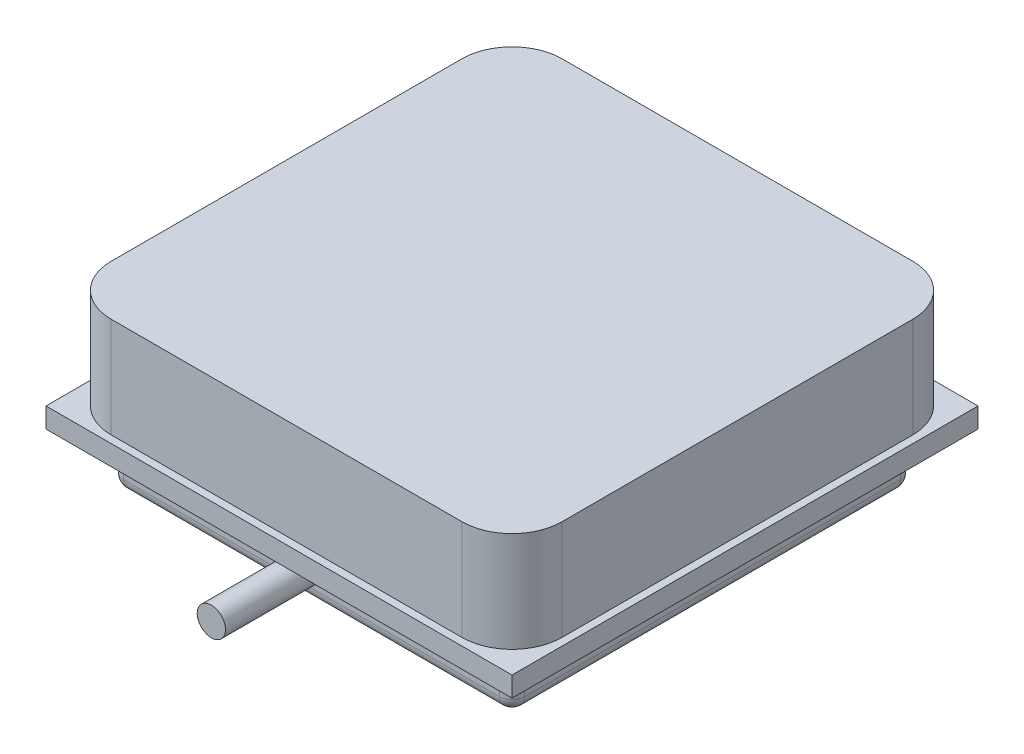
ISO-10303-21;
HEADER;
FILE_DESCRIPTION(('STEP AP214'),'2;1');
FILE_NAME('part.step','',(''),(''),'','','');
FILE_SCHEMA(('AUTOMOTIVE_DESIGN { 1 0 10303 214 1 1 1 1 }'));
ENDSEC;
DATA;
#1=APPLICATION_CONTEXT('core data for automotive mechanical design processes');
#2=APPLICATION_PROTOCOL_DEFINITION('international standard','automotive_design',2000,#1);
#3=PRODUCT_CONTEXT('',#1,'mechanical');
#4=PRODUCT('Part','Part','',(#3));
#5=PRODUCT_RELATED_PRODUCT_CATEGORY('part','',(#4));
#6=PRODUCT_DEFINITION_FORMATION('','',#4);
#7=PRODUCT_DEFINITION_CONTEXT('part definition',#1,'design');
#8=PRODUCT_DEFINITION('design','',#6,#7);
#9=PRODUCT_DEFINITION_SHAPE('','',#8);
#10=(LENGTH_UNIT() NAMED_UNIT(*) SI_UNIT(.MILLI.,.METRE.));
#11=(NAMED_UNIT(*) PLANE_ANGLE_UNIT() SI_UNIT($,.RADIAN.));
#12=(NAMED_UNIT(*) SI_UNIT($,.STERADIAN.) SOLID_ANGLE_UNIT());
#13=UNCERTAINTY_MEASURE_WITH_UNIT(LENGTH_MEASURE(1.E-05),#10,'distance_accuracy_value','');
#14=(GEOMETRIC_REPRESENTATION_CONTEXT(3) GLOBAL_UNCERTAINTY_ASSIGNED_CONTEXT((#13)) GLOBAL_UNIT_ASSIGNED_CONTEXT((#10,
#11,#12)) REPRESENTATION_CONTEXT('',''));
#15=CARTESIAN_POINT('',(0.,0.,0.));
#16=DIRECTION('',(0.,0.,1.));
#17=DIRECTION('',(1.,0.,0.));
#18=AXIS2_PLACEMENT_3D('',#15,#16,#17);
#19=CARTESIAN_POINT('',(0.,0.,0.));
#20=DIRECTION('',(0.,1.,0.));
#21=DIRECTION('',(0.,0.,1.));
#22=AXIS2_PLACEMENT_3D('',#19,#20,#21);
#23=PLANE('',#22);
#24=DIRECTION('',(0.,0.,-1.));
#25=VECTOR('',#24,1.);
#26=CARTESIAN_POINT('',(9.3,0.,-9.3));
#27=LINE('',#26,#25);
#28=CARTESIAN_POINT('',(9.3,0.,9.3));
#29=VERTEX_POINT('',#28);
#30=CARTESIAN_POINT('',(9.3,0.,-9.3));
#31=VERTEX_POINT('',#30);
#32=EDGE_CURVE('E217',#29,#31,#27,.T.);
#33=ORIENTED_EDGE('',*,*,#32,.F.);
#34=DIRECTION('',(1.,0.,0.));
#35=VECTOR('',#34,1.);
#36=CARTESIAN_POINT('',(-9.3,0.,9.3));
#37=LINE('',#36,#35);
#38=CARTESIAN_POINT('',(-9.3,0.,9.3));
#39=VERTEX_POINT('',#38);
#40=EDGE_CURVE('E213',#39,#29,#37,.T.);
#41=ORIENTED_EDGE('',*,*,#40,.F.);
#42=DIRECTION('',(0.,0.,1.));
#43=VECTOR('',#42,1.);
#44=CARTESIAN_POINT('',(-9.3,0.,-9.3));
#45=LINE('',#44,#43);
#46=CARTESIAN_POINT('',(-9.3,0.,-9.3));
#47=VERTEX_POINT('',#46);
#48=EDGE_CURVE('E444',#47,#39,#45,.T.);
#49=ORIENTED_EDGE('',*,*,#48,.F.);
#50=DIRECTION('',(-1.,0.,0.));
#51=VECTOR('',#50,1.);
#52=CARTESIAN_POINT('',(-9.3,0.,-9.3));
#53=LINE('',#52,#51);
#54=EDGE_CURVE('E441',#31,#47,#53,.T.);
#55=ORIENTED_EDGE('',*,*,#54,.F.);
#56=EDGE_LOOP('',(#33,#41,#49,#55));
#57=FACE_BOUND('',#56,.T.);
#58=DIRECTION('',(0.,0.,1.));
#59=VECTOR('',#58,1.);
#60=CARTESIAN_POINT('',(8.,0.,8.));
#61=LINE('',#60,#59);
#62=CARTESIAN_POINT('',(8.,0.,-7.5));
#63=VERTEX_POINT('',#62);
#64=CARTESIAN_POINT('',(8.,0.,7.5));
#65=VERTEX_POINT('',#64);
#66=EDGE_CURVE('E381',#63,#65,#61,.T.);
#67=ORIENTED_EDGE('',*,*,#66,.F.);
#68=CARTESIAN_POINT('',(7.5,0.,-7.5));
#69=DIRECTION('',(0.,1.,0.));
#70=DIRECTION('',(0.,0.,1.));
#71=AXIS2_PLACEMENT_3D('',#68,#69,#70);
#72=CIRCLE('',#71,0.5);
#73=CARTESIAN_POINT('',(7.5,0.,-8.));
#74=VERTEX_POINT('',#73);
#75=EDGE_CURVE('E328',#63,#74,#72,.T.);
#76=ORIENTED_EDGE('',*,*,#75,.T.);
#77=DIRECTION('',(1.,0.,0.));
#78=VECTOR('',#77,1.);
#79=CARTESIAN_POINT('',(-8.,0.,-8.));
#80=LINE('',#79,#78);
#81=CARTESIAN_POINT('',(-7.5,0.,-8.));
#82=VERTEX_POINT('',#81);
#83=EDGE_CURVE('E398',#82,#74,#80,.T.);
#84=ORIENTED_EDGE('',*,*,#83,.F.);
#85=CARTESIAN_POINT('',(-7.5,0.,-7.5));
#86=DIRECTION('',(0.,1.,0.));
#87=DIRECTION('',(0.,0.,1.));
#88=AXIS2_PLACEMENT_3D('',#85,#86,#87);
#89=CIRCLE('',#88,0.5);
#90=CARTESIAN_POINT('',(-8.,0.,-7.5));
#91=VERTEX_POINT('',#90);
#92=EDGE_CURVE('E325',#82,#91,#89,.T.);
#93=ORIENTED_EDGE('',*,*,#92,.T.);
#94=DIRECTION('',(0.,0.,-1.));
#95=VECTOR('',#94,1.);
#96=CARTESIAN_POINT('',(-8.,0.,8.));
#97=LINE('',#96,#95);
#98=CARTESIAN_POINT('',(-8.,0.,7.5));
#99=VERTEX_POINT('',#98);
#100=EDGE_CURVE('E391',#99,#91,#97,.T.);
#101=ORIENTED_EDGE('',*,*,#100,.F.);
#102=CARTESIAN_POINT('',(-7.5,0.,7.5));
#103=DIRECTION('',(0.,1.,0.));
#104=DIRECTION('',(0.,0.,1.));
#105=AXIS2_PLACEMENT_3D('',#102,#103,#104);
#106=CIRCLE('',#105,0.5);
#107=CARTESIAN_POINT('',(-7.5,0.,8.));
#108=VERTEX_POINT('',#107);
#109=EDGE_CURVE('E50',#99,#108,#106,.T.);
#110=ORIENTED_EDGE('',*,*,#109,.T.);
#111=DIRECTION('',(-1.,0.,0.));
#112=VECTOR('',#111,1.);
#113=CARTESIAN_POINT('',(-8.,0.,8.));
#114=LINE('',#113,#112);
#115=CARTESIAN_POINT('',(7.5,0.,8.));
#116=VERTEX_POINT('',#115);
#117=EDGE_CURVE('E386',#116,#108,#114,.T.);
#118=ORIENTED_EDGE('',*,*,#117,.F.);
#119=CARTESIAN_POINT('',(7.5,0.,7.5));
#120=DIRECTION('',(0.,1.,0.));
#121=DIRECTION('',(0.,0.,1.));
#122=AXIS2_PLACEMENT_3D('',#119,#120,#121);
#123=CIRCLE('',#122,0.5);
#124=EDGE_CURVE('E331',#116,#65,#123,.T.);
#125=ORIENTED_EDGE('',*,*,#124,.T.);
#126=EDGE_LOOP('',(#67,#76,#84,#93,#101,#110,#118,#125));
#127=FACE_BOUND('',#126,.T.);
#128=ADVANCED_FACE('F41',(#57,#127),#23,.F.);
#129=CARTESIAN_POINT('',(9.3,0.8,-9.3));
#130=DIRECTION('',(-1.,0.,0.));
#131=DIRECTION('',(0.,0.,1.));
#132=AXIS2_PLACEMENT_3D('',#129,#130,#131);
#133=PLANE('',#132);
#134=ORIENTED_EDGE('',*,*,#32,.T.);
#135=DIRECTION('',(0.,-1.,0.));
#136=VECTOR('',#135,1.);
#137=CARTESIAN_POINT('',(9.3,0.8,-9.3));
#138=LINE('',#137,#136);
#139=CARTESIAN_POINT('',(9.3,0.8,-9.3));
#140=VERTEX_POINT('',#139);
#141=EDGE_CURVE('E195',#140,#31,#138,.T.);
#142=ORIENTED_EDGE('',*,*,#141,.F.);
#143=DIRECTION('',(0.,0.,-1.));
#144=VECTOR('',#143,1.);
#145=CARTESIAN_POINT('',(9.3,0.8,-9.3));
#146=LINE('',#145,#144);
#147=CARTESIAN_POINT('',(9.3,0.8,9.3));
#148=VERTEX_POINT('',#147);
#149=EDGE_CURVE('E203',#148,#140,#146,.T.);
#150=ORIENTED_EDGE('',*,*,#149,.F.);
#151=DIRECTION('',(0.,-1.,0.));
#152=VECTOR('',#151,1.);
#153=CARTESIAN_POINT('',(9.3,0.8,9.3));
#154=LINE('',#153,#152);
#155=EDGE_CURVE('E438',#148,#29,#154,.T.);
#156=ORIENTED_EDGE('',*,*,#155,.T.);
#157=EDGE_LOOP('',(#134,#142,#150,#156));
#158=FACE_BOUND('',#157,.T.);
#159=ADVANCED_FACE('F215',(#158),#133,.F.);
#160=CARTESIAN_POINT('',(-9.3,0.8,-9.3));
#161=DIRECTION('',(0.,0.,1.));
#162=DIRECTION('',(1.,0.,0.));
#163=AXIS2_PLACEMENT_3D('',#160,#161,#162);
#164=PLANE('',#163);
#165=ORIENTED_EDGE('',*,*,#54,.T.);
#166=DIRECTION('',(0.,-1.,0.));
#167=VECTOR('',#166,1.);
#168=CARTESIAN_POINT('',(-9.3,0.8,-9.3));
#169=LINE('',#168,#167);
#170=CARTESIAN_POINT('',(-9.3,0.8,-9.3));
#171=VERTEX_POINT('',#170);
#172=EDGE_CURVE('E198',#171,#47,#169,.T.);
#173=ORIENTED_EDGE('',*,*,#172,.F.);
#174=DIRECTION('',(-1.,0.,0.));
#175=VECTOR('',#174,1.);
#176=CARTESIAN_POINT('',(-9.3,0.8,-9.3));
#177=LINE('',#176,#175);
#178=EDGE_CURVE('E191',#140,#171,#177,.T.);
#179=ORIENTED_EDGE('',*,*,#178,.F.);
#180=ORIENTED_EDGE('',*,*,#141,.T.);
#181=EDGE_LOOP('',(#165,#173,#179,#180));
#182=FACE_BOUND('',#181,.T.);
#183=ADVANCED_FACE('F193',(#182),#164,.F.);
#184=CARTESIAN_POINT('',(-9.3,0.8,-9.3));
#185=DIRECTION('',(1.,0.,0.));
#186=DIRECTION('',(0.,0.,-1.));
#187=AXIS2_PLACEMENT_3D('',#184,#185,#186);
#188=PLANE('',#187);
#189=ORIENTED_EDGE('',*,*,#48,.T.);
#190=DIRECTION('',(0.,-1.,0.));
#191=VECTOR('',#190,1.);
#192=CARTESIAN_POINT('',(-9.3,0.8,9.3));
#193=LINE('',#192,#191);
#194=CARTESIAN_POINT('',(-9.3,0.8,9.3));
#195=VERTEX_POINT('',#194);
#196=EDGE_CURVE('E225',#195,#39,#193,.T.);
#197=ORIENTED_EDGE('',*,*,#196,.F.);
#198=DIRECTION('',(0.,0.,1.));
#199=VECTOR('',#198,1.);
#200=CARTESIAN_POINT('',(-9.3,0.8,-9.3));
#201=LINE('',#200,#199);
#202=EDGE_CURVE('E202',#171,#195,#201,.T.);
#203=ORIENTED_EDGE('',*,*,#202,.F.);
#204=ORIENTED_EDGE('',*,*,#172,.T.);
#205=EDGE_LOOP('',(#189,#197,#203,#204));
#206=FACE_BOUND('',#205,.T.);
#207=ADVANCED_FACE('F460',(#206),#188,.F.);
#208=CARTESIAN_POINT('',(-9.3,0.8,9.3));
#209=DIRECTION('',(0.,0.,-1.));
#210=DIRECTION('',(-1.,0.,0.));
#211=AXIS2_PLACEMENT_3D('',#208,#209,#210);
#212=PLANE('',#211);
#213=ORIENTED_EDGE('',*,*,#40,.T.);
#214=ORIENTED_EDGE('',*,*,#155,.F.);
#215=DIRECTION('',(1.,0.,0.));
#216=VECTOR('',#215,1.);
#217=CARTESIAN_POINT('',(-9.3,0.8,9.3));
#218=LINE('',#217,#216);
#219=EDGE_CURVE('E208',#195,#148,#218,.T.);
#220=ORIENTED_EDGE('',*,*,#219,.F.);
#221=ORIENTED_EDGE('',*,*,#196,.T.);
#222=EDGE_LOOP('',(#213,#214,#220,#221));
#223=FACE_BOUND('',#222,.T.);
#224=ADVANCED_FACE('F455',(#223),#212,.F.);
#225=CARTESIAN_POINT('',(0.,0.8,0.));
#226=DIRECTION('',(0.,1.,0.));
#227=DIRECTION('',(0.,0.,1.));
#228=AXIS2_PLACEMENT_3D('',#225,#226,#227);
#229=PLANE('',#228);
#230=DIRECTION('',(0.,0.,-1.));
#231=VECTOR('',#230,1.);
#232=CARTESIAN_POINT('',(9.,0.8,-9.));
#233=LINE('',#232,#231);
#234=CARTESIAN_POINT('',(9.,0.8,7.));
#235=VERTEX_POINT('',#234);
#236=CARTESIAN_POINT('',(9.,0.8,-7.));
#237=VERTEX_POINT('',#236);
#238=EDGE_CURVE('E402',#235,#237,#233,.T.);
#239=ORIENTED_EDGE('',*,*,#238,.F.);
#240=CARTESIAN_POINT('',(7.,0.8,7.));
#241=DIRECTION('',(0.,1.,0.));
#242=DIRECTION('',(0.,0.,1.));
#243=AXIS2_PLACEMENT_3D('',#240,#241,#242);
#244=CIRCLE('',#243,2.);
#245=CARTESIAN_POINT('',(7.,0.8,9.));
#246=VERTEX_POINT('',#245);
#247=EDGE_CURVE('E271',#235,#246,#244,.F.);
#248=ORIENTED_EDGE('',*,*,#247,.T.);
#249=DIRECTION('',(1.,0.,0.));
#250=VECTOR('',#249,1.);
#251=CARTESIAN_POINT('',(-9.,0.8,9.));
#252=LINE('',#251,#250);
#253=CARTESIAN_POINT('',(-7.,0.8,9.));
#254=VERTEX_POINT('',#253);
#255=EDGE_CURVE('E408',#254,#246,#252,.T.);
#256=ORIENTED_EDGE('',*,*,#255,.F.);
#257=CARTESIAN_POINT('',(-7.,0.8,7.));
#258=DIRECTION('',(0.,1.,0.));
#259=DIRECTION('',(0.,0.,1.));
#260=AXIS2_PLACEMENT_3D('',#257,#258,#259);
#261=CIRCLE('',#260,2.);
#262=CARTESIAN_POINT('',(-9.,0.8,7.));
#263=VERTEX_POINT('',#262);
#264=EDGE_CURVE('E274',#254,#263,#261,.F.);
#265=ORIENTED_EDGE('',*,*,#264,.T.);
#266=DIRECTION('',(0.,0.,1.));
#267=VECTOR('',#266,1.);
#268=CARTESIAN_POINT('',(-9.,0.8,-9.));
#269=LINE('',#268,#267);
#270=CARTESIAN_POINT('',(-9.,0.8,-7.));
#271=VERTEX_POINT('',#270);
#272=EDGE_CURVE('E427',#271,#263,#269,.T.);
#273=ORIENTED_EDGE('',*,*,#272,.F.);
#274=CARTESIAN_POINT('',(-7.,0.8,-7.));
#275=DIRECTION('',(0.,1.,0.));
#276=DIRECTION('',(0.,0.,1.));
#277=AXIS2_PLACEMENT_3D('',#274,#275,#276);
#278=CIRCLE('',#277,2.);
#279=CARTESIAN_POINT('',(-7.,0.8,-9.));
#280=VERTEX_POINT('',#279);
#281=EDGE_CURVE('E265',#271,#280,#278,.F.);
#282=ORIENTED_EDGE('',*,*,#281,.T.);
#283=DIRECTION('',(-1.,0.,0.));
#284=VECTOR('',#283,1.);
#285=CARTESIAN_POINT('',(-9.,0.8,-9.));
#286=LINE('',#285,#284);
#287=CARTESIAN_POINT('',(7.,0.8,-9.));
#288=VERTEX_POINT('',#287);
#289=EDGE_CURVE('E423',#288,#280,#286,.T.);
#290=ORIENTED_EDGE('',*,*,#289,.F.);
#291=CARTESIAN_POINT('',(7.,0.8,-7.));
#292=DIRECTION('',(0.,1.,0.));
#293=DIRECTION('',(0.,0.,1.));
#294=AXIS2_PLACEMENT_3D('',#291,#292,#293);
#295=CIRCLE('',#294,2.);
#296=EDGE_CURVE('E268',#288,#237,#295,.F.);
#297=ORIENTED_EDGE('',*,*,#296,.T.);
#298=EDGE_LOOP('',(#239,#248,#256,#265,#273,#282,#290,#297));
#299=FACE_BOUND('',#298,.T.);
#300=ORIENTED_EDGE('',*,*,#149,.T.);
#301=ORIENTED_EDGE('',*,*,#178,.T.);
#302=ORIENTED_EDGE('',*,*,#202,.T.);
#303=ORIENTED_EDGE('',*,*,#219,.T.);
#304=EDGE_LOOP('',(#300,#301,#302,#303));
#305=FACE_BOUND('',#304,.T.);
#306=ADVANCED_FACE('F206',(#299,#305),#229,.T.);
#307=CARTESIAN_POINT('',(9.,4.8,-9.));
#308=DIRECTION('',(-1.,0.,0.));
#309=DIRECTION('',(0.,0.,1.));
#310=AXIS2_PLACEMENT_3D('',#307,#308,#309);
#311=PLANE('',#310);
#312=ORIENTED_EDGE('',*,*,#238,.T.);
#313=DIRECTION('',(0.,-1.,0.));
#314=VECTOR('',#313,1.);
#315=CARTESIAN_POINT('',(9.,4.8,-7.));
#316=LINE('',#315,#314);
#317=CARTESIAN_POINT('',(9.,4.8,-7.));
#318=VERTEX_POINT('',#317);
#319=EDGE_CURVE('E255',#237,#318,#316,.F.);
#320=ORIENTED_EDGE('',*,*,#319,.T.);
#321=DIRECTION('',(0.,0.,-1.));
#322=VECTOR('',#321,1.);
#323=CARTESIAN_POINT('',(9.,4.8,-9.));
#324=LINE('',#323,#322);
#325=CARTESIAN_POINT('',(9.,4.8,7.));
#326=VERTEX_POINT('',#325);
#327=EDGE_CURVE('E403',#326,#318,#324,.T.);
#328=ORIENTED_EDGE('',*,*,#327,.F.);
#329=DIRECTION('',(0.,-1.,0.));
#330=VECTOR('',#329,1.);
#331=CARTESIAN_POINT('',(9.,4.8,7.));
#332=LINE('',#331,#330);
#333=EDGE_CURVE('E251',#326,#235,#332,.T.);
#334=ORIENTED_EDGE('',*,*,#333,.T.);
#335=EDGE_LOOP('',(#312,#320,#328,#334));
#336=FACE_BOUND('',#335,.T.);
#337=ADVANCED_FACE('F478',(#336),#311,.F.);
#338=CARTESIAN_POINT('',(-9.,4.8,-9.));
#339=DIRECTION('',(0.,0.,1.));
#340=DIRECTION('',(1.,0.,0.));
#341=AXIS2_PLACEMENT_3D('',#338,#339,#340);
#342=PLANE('',#341);
#343=ORIENTED_EDGE('',*,*,#289,.T.);
#344=DIRECTION('',(0.,-1.,0.));
#345=VECTOR('',#344,1.);
#346=CARTESIAN_POINT('',(-7.,4.8,-9.));
#347=LINE('',#346,#345);
#348=CARTESIAN_POINT('',(-7.,4.8,-9.));
#349=VERTEX_POINT('',#348);
#350=EDGE_CURVE('E236',#280,#349,#347,.F.);
#351=ORIENTED_EDGE('',*,*,#350,.T.);
#352=DIRECTION('',(-1.,0.,0.));
#353=VECTOR('',#352,1.);
#354=CARTESIAN_POINT('',(-9.,4.8,-9.));
#355=LINE('',#354,#353);
#356=CARTESIAN_POINT('',(7.,4.8,-9.));
#357=VERTEX_POINT('',#356);
#358=EDGE_CURVE('E407',#357,#349,#355,.T.);
#359=ORIENTED_EDGE('',*,*,#358,.F.);
#360=DIRECTION('',(0.,-1.,0.));
#361=VECTOR('',#360,1.);
#362=CARTESIAN_POINT('',(7.,4.8,-9.));
#363=LINE('',#362,#361);
#364=EDGE_CURVE('E232',#357,#288,#363,.T.);
#365=ORIENTED_EDGE('',*,*,#364,.T.);
#366=EDGE_LOOP('',(#343,#351,#359,#365));
#367=FACE_BOUND('',#366,.T.);
#368=ADVANCED_FACE('F482',(#367),#342,.F.);
#369=CARTESIAN_POINT('',(-9.,4.8,-9.));
#370=DIRECTION('',(1.,0.,0.));
#371=DIRECTION('',(0.,0.,-1.));
#372=AXIS2_PLACEMENT_3D('',#369,#370,#371);
#373=PLANE('',#372);
#374=DIRECTION('',(0.,0.,1.));
#375=VECTOR('',#374,1.);
#376=CARTESIAN_POINT('',(-9.,4.8,-9.));
#377=LINE('',#376,#375);
#378=CARTESIAN_POINT('',(-9.,4.8,-7.));
#379=VERTEX_POINT('',#378);
#380=CARTESIAN_POINT('',(-9.,4.8,7.));
#381=VERTEX_POINT('',#380);
#382=EDGE_CURVE('E412',#379,#381,#377,.T.);
#383=ORIENTED_EDGE('',*,*,#382,.F.);
#384=DIRECTION('',(0.,-1.,0.));
#385=VECTOR('',#384,1.);
#386=CARTESIAN_POINT('',(-9.,4.8,-7.));
#387=LINE('',#386,#385);
#388=EDGE_CURVE('E223',#379,#271,#387,.T.);
#389=ORIENTED_EDGE('',*,*,#388,.T.);
#390=ORIENTED_EDGE('',*,*,#272,.T.);
#391=DIRECTION('',(0.,-1.,0.));
#392=VECTOR('',#391,1.);
#393=CARTESIAN_POINT('',(-9.,4.8,7.));
#394=LINE('',#393,#392);
#395=EDGE_CURVE('E219',#263,#381,#394,.F.);
#396=ORIENTED_EDGE('',*,*,#395,.T.);
#397=EDGE_LOOP('',(#383,#389,#390,#396));
#398=FACE_BOUND('',#397,.T.);
#399=ADVANCED_FACE('F486',(#398),#373,.F.);
#400=CARTESIAN_POINT('',(-9.,4.8,9.));
#401=DIRECTION('',(0.,0.,-1.));
#402=DIRECTION('',(-1.,0.,0.));
#403=AXIS2_PLACEMENT_3D('',#400,#401,#402);
#404=PLANE('',#403);
#405=ORIENTED_EDGE('',*,*,#255,.T.);
#406=DIRECTION('',(0.,-1.,0.));
#407=VECTOR('',#406,1.);
#408=CARTESIAN_POINT('',(7.,4.8,9.));
#409=LINE('',#408,#407);
#410=CARTESIAN_POINT('',(7.,4.8,9.));
#411=VERTEX_POINT('',#410);
#412=EDGE_CURVE('E262',#246,#411,#409,.F.);
#413=ORIENTED_EDGE('',*,*,#412,.T.);
#414=DIRECTION('',(1.,0.,0.));
#415=VECTOR('',#414,1.);
#416=CARTESIAN_POINT('',(-9.,4.8,9.));
#417=LINE('',#416,#415);
#418=CARTESIAN_POINT('',(-7.,4.8,9.));
#419=VERTEX_POINT('',#418);
#420=EDGE_CURVE('E416',#419,#411,#417,.T.);
#421=ORIENTED_EDGE('',*,*,#420,.F.);
#422=DIRECTION('',(0.,-1.,0.));
#423=VECTOR('',#422,1.);
#424=CARTESIAN_POINT('',(-7.,4.8,9.));
#425=LINE('',#424,#423);
#426=EDGE_CURVE('E258',#419,#254,#425,.T.);
#427=ORIENTED_EDGE('',*,*,#426,.T.);
#428=EDGE_LOOP('',(#405,#413,#421,#427));
#429=FACE_BOUND('',#428,.T.);
#430=ADVANCED_FACE('F490',(#429),#404,.F.);
#431=CARTESIAN_POINT('',(0.,4.8,0.));
#432=DIRECTION('',(0.,1.,0.));
#433=DIRECTION('',(0.,0.,1.));
#434=AXIS2_PLACEMENT_3D('',#431,#432,#433);
#435=PLANE('',#434);
#436=ORIENTED_EDGE('',*,*,#358,.T.);
#437=CARTESIAN_POINT('',(-7.,4.8,-7.));
#438=DIRECTION('',(0.,1.,0.));
#439=DIRECTION('',(0.,0.,1.));
#440=AXIS2_PLACEMENT_3D('',#437,#438,#439);
#441=CIRCLE('',#440,2.);
#442=EDGE_CURVE('E248',#349,#379,#441,.T.);
#443=ORIENTED_EDGE('',*,*,#442,.T.);
#444=ORIENTED_EDGE('',*,*,#382,.T.);
#445=CARTESIAN_POINT('',(-7.,4.8,7.));
#446=DIRECTION('',(0.,1.,0.));
#447=DIRECTION('',(0.,0.,1.));
#448=AXIS2_PLACEMENT_3D('',#445,#446,#447);
#449=CIRCLE('',#448,2.);
#450=EDGE_CURVE('E239',#381,#419,#449,.T.);
#451=ORIENTED_EDGE('',*,*,#450,.T.);
#452=ORIENTED_EDGE('',*,*,#420,.T.);
#453=CARTESIAN_POINT('',(7.,4.8,7.));
#454=DIRECTION('',(0.,1.,0.));
#455=DIRECTION('',(0.,0.,1.));
#456=AXIS2_PLACEMENT_3D('',#453,#454,#455);
#457=CIRCLE('',#456,2.);
#458=EDGE_CURVE('E242',#411,#326,#457,.T.);
#459=ORIENTED_EDGE('',*,*,#458,.T.);
#460=ORIENTED_EDGE('',*,*,#327,.T.);
#461=CARTESIAN_POINT('',(7.,4.8,-7.));
#462=DIRECTION('',(0.,1.,0.));
#463=DIRECTION('',(0.,0.,1.));
#464=AXIS2_PLACEMENT_3D('',#461,#462,#463);
#465=CIRCLE('',#464,2.);
#466=EDGE_CURVE('E245',#318,#357,#465,.T.);
#467=ORIENTED_EDGE('',*,*,#466,.T.);
#468=EDGE_LOOP('',(#436,#443,#444,#451,#452,#459,#460,#467));
#469=FACE_BOUND('',#468,.T.);
#470=ADVANCED_FACE('F494',(#469),#435,.T.);
#471=CARTESIAN_POINT('',(8.,-2.,8.));
#472=DIRECTION('',(-1.,0.,0.));
#473=DIRECTION('',(0.,0.,1.));
#474=AXIS2_PLACEMENT_3D('',#471,#472,#473);
#475=PLANE('',#474);
#476=DIRECTION('',(0.,0.,1.));
#477=VECTOR('',#476,1.);
#478=CARTESIAN_POINT('',(8.,-1.5,-8.));
#479=LINE('',#478,#477);
#480=CARTESIAN_POINT('',(8.,-1.5,7.5));
#481=VERTEX_POINT('',#480);
#482=CARTESIAN_POINT('',(8.,-1.5,-7.5));
#483=VERTEX_POINT('',#482);
#484=EDGE_CURVE('E57',#481,#483,#479,.F.);
#485=ORIENTED_EDGE('',*,*,#484,.T.);
#486=DIRECTION('',(0.,1.,0.));
#487=VECTOR('',#486,1.);
#488=CARTESIAN_POINT('',(8.,-2.,-7.5));
#489=LINE('',#488,#487);
#490=EDGE_CURVE('E322',#483,#63,#489,.T.);
#491=ORIENTED_EDGE('',*,*,#490,.T.);
#492=ORIENTED_EDGE('',*,*,#66,.T.);
#493=DIRECTION('',(0.,1.,0.));
#494=VECTOR('',#493,1.);
#495=CARTESIAN_POINT('',(8.,-2.,7.5));
#496=LINE('',#495,#494);
#497=EDGE_CURVE('E62',#65,#481,#496,.F.);
#498=ORIENTED_EDGE('',*,*,#497,.T.);
#499=EDGE_LOOP('',(#485,#491,#492,#498));
#500=FACE_BOUND('',#499,.T.);
#501=ADVANCED_FACE('F498',(#500),#475,.F.);
#502=CARTESIAN_POINT('',(-8.,-2.,8.));
#503=DIRECTION('',(0.,0.,-1.));
#504=DIRECTION('',(-1.,0.,0.));
#505=AXIS2_PLACEMENT_3D('',#502,#503,#504);
#506=PLANE('',#505);
#507=CARTESIAN_POINT('',(0.,-0.65,8.));
#508=DIRECTION('',(0.,0.,-1.));
#509=DIRECTION('',(-1.,0.,0.));
#510=AXIS2_PLACEMENT_3D('',#507,#508,#509);
#511=CIRCLE('',#510,0.565);
#512=CARTESIAN_POINT('',(-0.565,-0.65,8.));
#513=VERTEX_POINT('',#512);
#514=EDGE_CURVE('E11',#513,#513,#511,.F.);
#515=ORIENTED_EDGE('',*,*,#514,.F.);
#516=EDGE_LOOP('',(#515));
#517=FACE_BOUND('',#516,.T.);
#518=DIRECTION('',(-1.,0.,0.));
#519=VECTOR('',#518,1.);
#520=CARTESIAN_POINT('',(8.,-1.5,8.));
#521=LINE('',#520,#519);
#522=CARTESIAN_POINT('',(-7.5,-1.5,8.));
#523=VERTEX_POINT('',#522);
#524=CARTESIAN_POINT('',(7.5,-1.5,8.));
#525=VERTEX_POINT('',#524);
#526=EDGE_CURVE('E312',#523,#525,#521,.F.);
#527=ORIENTED_EDGE('',*,*,#526,.T.);
#528=DIRECTION('',(0.,1.,0.));
#529=VECTOR('',#528,1.);
#530=CARTESIAN_POINT('',(7.5,-2.,8.));
#531=LINE('',#530,#529);
#532=EDGE_CURVE('E315',#525,#116,#531,.T.);
#533=ORIENTED_EDGE('',*,*,#532,.T.);
#534=ORIENTED_EDGE('',*,*,#117,.T.);
#535=DIRECTION('',(0.,1.,0.));
#536=VECTOR('',#535,1.);
#537=CARTESIAN_POINT('',(-7.5,-2.,8.));
#538=LINE('',#537,#536);
#539=EDGE_CURVE('E309',#108,#523,#538,.F.);
#540=ORIENTED_EDGE('',*,*,#539,.T.);
#541=EDGE_LOOP('',(#527,#533,#534,#540));
#542=FACE_BOUND('',#541,.T.);
#543=ADVANCED_FACE('F502',(#517,#542),#506,.F.);
#544=CARTESIAN_POINT('',(-8.,-2.,8.));
#545=DIRECTION('',(1.,0.,0.));
#546=DIRECTION('',(0.,0.,-1.));
#547=AXIS2_PLACEMENT_3D('',#544,#545,#546);
#548=PLANE('',#547);
#549=ORIENTED_EDGE('',*,*,#100,.T.);
#550=DIRECTION('',(0.,1.,0.));
#551=VECTOR('',#550,1.);
#552=CARTESIAN_POINT('',(-8.,-2.,-7.5));
#553=LINE('',#552,#551);
#554=CARTESIAN_POINT('',(-8.,-1.5,-7.5));
#555=VERTEX_POINT('',#554);
#556=EDGE_CURVE('E306',#91,#555,#553,.F.);
#557=ORIENTED_EDGE('',*,*,#556,.T.);
#558=DIRECTION('',(0.,0.,-1.));
#559=VECTOR('',#558,1.);
#560=CARTESIAN_POINT('',(-8.,-1.5,8.));
#561=LINE('',#560,#559);
#562=CARTESIAN_POINT('',(-8.,-1.5,7.5));
#563=VERTEX_POINT('',#562);
#564=EDGE_CURVE('E303',#555,#563,#561,.F.);
#565=ORIENTED_EDGE('',*,*,#564,.T.);
#566=DIRECTION('',(0.,1.,0.));
#567=VECTOR('',#566,1.);
#568=CARTESIAN_POINT('',(-8.,-2.,7.5));
#569=LINE('',#568,#567);
#570=EDGE_CURVE('E300',#563,#99,#569,.T.);
#571=ORIENTED_EDGE('',*,*,#570,.T.);
#572=EDGE_LOOP('',(#549,#557,#565,#571));
#573=FACE_BOUND('',#572,.T.);
#574=ADVANCED_FACE('F505',(#573),#548,.F.);
#575=CARTESIAN_POINT('',(-8.,-2.,-8.));
#576=DIRECTION('',(0.,0.,1.));
#577=DIRECTION('',(1.,0.,0.));
#578=AXIS2_PLACEMENT_3D('',#575,#576,#577);
#579=PLANE('',#578);
#580=DIRECTION('',(1.,0.,0.));
#581=VECTOR('',#580,1.);
#582=CARTESIAN_POINT('',(-8.,-1.5,-8.));
#583=LINE('',#582,#581);
#584=CARTESIAN_POINT('',(7.5,-1.5,-8.));
#585=VERTEX_POINT('',#584);
#586=CARTESIAN_POINT('',(-7.5,-1.5,-8.));
#587=VERTEX_POINT('',#586);
#588=EDGE_CURVE('E293',#585,#587,#583,.F.);
#589=ORIENTED_EDGE('',*,*,#588,.T.);
#590=DIRECTION('',(0.,1.,0.));
#591=VECTOR('',#590,1.);
#592=CARTESIAN_POINT('',(-7.5,-2.,-8.));
#593=LINE('',#592,#591);
#594=EDGE_CURVE('E297',#587,#82,#593,.T.);
#595=ORIENTED_EDGE('',*,*,#594,.T.);
#596=ORIENTED_EDGE('',*,*,#83,.T.);
#597=DIRECTION('',(0.,1.,0.));
#598=VECTOR('',#597,1.);
#599=CARTESIAN_POINT('',(7.5,-2.,-8.));
#600=LINE('',#599,#598);
#601=EDGE_CURVE('E290',#74,#585,#600,.F.);
#602=ORIENTED_EDGE('',*,*,#601,.T.);
#603=EDGE_LOOP('',(#589,#595,#596,#602));
#604=FACE_BOUND('',#603,.T.);
#605=ADVANCED_FACE('F509',(#604),#579,.F.);
#606=CARTESIAN_POINT('',(0.,-2.,0.));
#607=DIRECTION('',(0.,-1.,0.));
#608=DIRECTION('',(0.,0.,-1.));
#609=AXIS2_PLACEMENT_3D('',#606,#607,#608);
#610=PLANE('',#609);
#611=DIRECTION('',(0.,0.,-1.));
#612=VECTOR('',#611,1.);
#613=CARTESIAN_POINT('',(-7.5,-2.,-8.));
#614=LINE('',#613,#612);
#615=CARTESIAN_POINT('',(-7.5,-2.,7.5));
#616=VERTEX_POINT('',#615);
#617=CARTESIAN_POINT('',(-7.5,-2.,-7.5));
#618=VERTEX_POINT('',#617);
#619=EDGE_CURVE('E283',#616,#618,#614,.T.);
#620=ORIENTED_EDGE('',*,*,#619,.T.);
#621=DIRECTION('',(1.,0.,0.));
#622=VECTOR('',#621,1.);
#623=CARTESIAN_POINT('',(8.,-2.,-7.5));
#624=LINE('',#623,#622);
#625=CARTESIAN_POINT('',(7.5,-2.,-7.5));
#626=VERTEX_POINT('',#625);
#627=EDGE_CURVE('E286',#618,#626,#624,.T.);
#628=ORIENTED_EDGE('',*,*,#627,.T.);
#629=DIRECTION('',(0.,0.,1.));
#630=VECTOR('',#629,1.);
#631=CARTESIAN_POINT('',(7.5,-2.,8.));
#632=LINE('',#631,#630);
#633=CARTESIAN_POINT('',(7.5,-2.,7.5));
#634=VERTEX_POINT('',#633);
#635=EDGE_CURVE('E277',#626,#634,#632,.T.);
#636=ORIENTED_EDGE('',*,*,#635,.T.);
#637=DIRECTION('',(-1.,0.,0.));
#638=VECTOR('',#637,1.);
#639=CARTESIAN_POINT('',(-8.,-2.,7.5));
#640=LINE('',#639,#638);
#641=EDGE_CURVE('E280',#634,#616,#640,.T.);
#642=ORIENTED_EDGE('',*,*,#641,.T.);
#643=EDGE_LOOP('',(#620,#628,#636,#642));
#644=FACE_BOUND('',#643,.T.);
#645=ADVANCED_FACE('F513',(#644),#610,.T.);
#646=CARTESIAN_POINT('',(-7.,4.8,-7.));
#647=DIRECTION('',(0.,-1.,0.));
#648=DIRECTION('',(0.,0.,-1.));
#649=AXIS2_PLACEMENT_3D('',#646,#647,#648);
#650=CYLINDRICAL_SURFACE('',#649,2.);
#651=ORIENTED_EDGE('',*,*,#442,.F.);
#652=ORIENTED_EDGE('',*,*,#350,.F.);
#653=ORIENTED_EDGE('',*,*,#281,.F.);
#654=ORIENTED_EDGE('',*,*,#388,.F.);
#655=EDGE_LOOP('',(#651,#652,#653,#654));
#656=FACE_BOUND('',#655,.T.);
#657=ADVANCED_FACE('F517',(#656),#650,.T.);
#658=CARTESIAN_POINT('',(7.,4.8,-7.));
#659=DIRECTION('',(0.,-1.,0.));
#660=DIRECTION('',(0.,0.,-1.));
#661=AXIS2_PLACEMENT_3D('',#658,#659,#660);
#662=CYLINDRICAL_SURFACE('',#661,2.);
#663=ORIENTED_EDGE('',*,*,#466,.F.);
#664=ORIENTED_EDGE('',*,*,#319,.F.);
#665=ORIENTED_EDGE('',*,*,#296,.F.);
#666=ORIENTED_EDGE('',*,*,#364,.F.);
#667=EDGE_LOOP('',(#663,#664,#665,#666));
#668=FACE_BOUND('',#667,.T.);
#669=ADVANCED_FACE('F606',(#668),#662,.T.);
#670=CARTESIAN_POINT('',(7.,4.8,7.));
#671=DIRECTION('',(0.,-1.,0.));
#672=DIRECTION('',(0.,0.,-1.));
#673=AXIS2_PLACEMENT_3D('',#670,#671,#672);
#674=CYLINDRICAL_SURFACE('',#673,2.);
#675=ORIENTED_EDGE('',*,*,#458,.F.);
#676=ORIENTED_EDGE('',*,*,#412,.F.);
#677=ORIENTED_EDGE('',*,*,#247,.F.);
#678=ORIENTED_EDGE('',*,*,#333,.F.);
#679=EDGE_LOOP('',(#675,#676,#677,#678));
#680=FACE_BOUND('',#679,.T.);
#681=ADVANCED_FACE('F600',(#680),#674,.T.);
#682=CARTESIAN_POINT('',(-7.,4.8,7.));
#683=DIRECTION('',(0.,-1.,0.));
#684=DIRECTION('',(0.,0.,-1.));
#685=AXIS2_PLACEMENT_3D('',#682,#683,#684);
#686=CYLINDRICAL_SURFACE('',#685,2.);
#687=ORIENTED_EDGE('',*,*,#450,.F.);
#688=ORIENTED_EDGE('',*,*,#395,.F.);
#689=ORIENTED_EDGE('',*,*,#264,.F.);
#690=ORIENTED_EDGE('',*,*,#426,.F.);
#691=EDGE_LOOP('',(#687,#688,#689,#690));
#692=FACE_BOUND('',#691,.T.);
#693=ADVANCED_FACE('F594',(#692),#686,.T.);
#694=CARTESIAN_POINT('',(-7.5,-2.,7.5));
#695=DIRECTION('',(0.,1.,0.));
#696=DIRECTION('',(0.,0.,1.));
#697=AXIS2_PLACEMENT_3D('',#694,#695,#696);
#698=CYLINDRICAL_SURFACE('',#697,0.5);
#699=ORIENTED_EDGE('',*,*,#109,.F.);
#700=ORIENTED_EDGE('',*,*,#570,.F.);
#701=CARTESIAN_POINT('',(-7.5,-1.5,7.5));
#702=DIRECTION('',(0.,-1.,0.));
#703=DIRECTION('',(0.,0.,-1.));
#704=AXIS2_PLACEMENT_3D('',#701,#702,#703);
#705=CIRCLE('',#704,0.5);
#706=EDGE_CURVE('E378',#523,#563,#705,.T.);
#707=ORIENTED_EDGE('',*,*,#706,.F.);
#708=ORIENTED_EDGE('',*,*,#539,.F.);
#709=EDGE_LOOP('',(#699,#700,#707,#708));
#710=FACE_BOUND('',#709,.T.);
#711=ADVANCED_FACE('F43',(#710),#698,.T.);
#712=CARTESIAN_POINT('',(0.,-1.5,7.5));
#713=DIRECTION('',(1.,0.,0.));
#714=DIRECTION('',(0.,0.,-1.));
#715=AXIS2_PLACEMENT_3D('',#712,#713,#714);
#716=CYLINDRICAL_SURFACE('',#715,0.5);
#717=CARTESIAN_POINT('',(7.5,-1.5,7.5));
#718=DIRECTION('',(1.,0.,0.));
#719=DIRECTION('',(0.,0.,-1.));
#720=AXIS2_PLACEMENT_3D('',#717,#718,#719);
#721=CIRCLE('',#720,0.5);
#722=EDGE_CURVE('E371',#525,#634,#721,.T.);
#723=ORIENTED_EDGE('',*,*,#722,.F.);
#724=ORIENTED_EDGE('',*,*,#526,.F.);
#725=CARTESIAN_POINT('',(-7.5,-1.5,7.5));
#726=DIRECTION('',(-1.,0.,0.));
#727=DIRECTION('',(0.,0.,1.));
#728=AXIS2_PLACEMENT_3D('',#725,#726,#727);
#729=CIRCLE('',#728,0.5);
#730=EDGE_CURVE('E375',#616,#523,#729,.T.);
#731=ORIENTED_EDGE('',*,*,#730,.F.);
#732=ORIENTED_EDGE('',*,*,#641,.F.);
#733=EDGE_LOOP('',(#723,#724,#731,#732));
#734=FACE_BOUND('',#733,.T.);
#735=ADVANCED_FACE('F547',(#734),#716,.T.);
#736=CARTESIAN_POINT('',(7.5,-2.,7.5));
#737=DIRECTION('',(0.,1.,0.));
#738=DIRECTION('',(0.,0.,1.));
#739=AXIS2_PLACEMENT_3D('',#736,#737,#738);
#740=CYLINDRICAL_SURFACE('',#739,0.5);
#741=ORIENTED_EDGE('',*,*,#124,.F.);
#742=ORIENTED_EDGE('',*,*,#532,.F.);
#743=CARTESIAN_POINT('',(7.5,-1.5,7.5));
#744=DIRECTION('',(0.,-1.,0.));
#745=DIRECTION('',(0.,0.,-1.));
#746=AXIS2_PLACEMENT_3D('',#743,#744,#745);
#747=CIRCLE('',#746,0.5);
#748=EDGE_CURVE('E367',#481,#525,#747,.T.);
#749=ORIENTED_EDGE('',*,*,#748,.F.);
#750=ORIENTED_EDGE('',*,*,#497,.F.);
#751=EDGE_LOOP('',(#741,#742,#749,#750));
#752=FACE_BOUND('',#751,.T.);
#753=ADVANCED_FACE('F544',(#752),#740,.T.);
#754=CARTESIAN_POINT('',(-7.5,-1.5,7.5));
#755=DIRECTION('',(0.,0.,1.));
#756=DIRECTION('',(1.,0.,0.));
#757=AXIS2_PLACEMENT_3D('',#754,#755,#756);
#758=SPHERICAL_SURFACE('',#757,0.5);
#759=ORIENTED_EDGE('',*,*,#730,.T.);
#760=ORIENTED_EDGE('',*,*,#706,.T.);
#761=CARTESIAN_POINT('',(-7.5,-1.5,7.5));
#762=DIRECTION('',(0.,0.,1.));
#763=DIRECTION('',(1.,0.,0.));
#764=AXIS2_PLACEMENT_3D('',#761,#762,#763);
#765=CIRCLE('',#764,0.5);
#766=EDGE_CURVE('E363',#616,#563,#765,.F.);
#767=ORIENTED_EDGE('',*,*,#766,.F.);
#768=EDGE_LOOP('',(#759,#760,#767));
#769=FACE_BOUND('',#768,.T.);
#770=ADVANCED_FACE('F580',(#769),#758,.T.);
#771=CARTESIAN_POINT('',(7.5,-1.5,7.5));
#772=DIRECTION('',(0.,0.,1.));
#773=DIRECTION('',(1.,0.,0.));
#774=AXIS2_PLACEMENT_3D('',#771,#772,#773);
#775=SPHERICAL_SURFACE('',#774,0.5);
#776=ORIENTED_EDGE('',*,*,#748,.T.);
#777=ORIENTED_EDGE('',*,*,#722,.T.);
#778=CARTESIAN_POINT('',(7.5,-1.5,7.5));
#779=DIRECTION('',(0.,0.,1.));
#780=DIRECTION('',(1.,0.,0.));
#781=AXIS2_PLACEMENT_3D('',#778,#779,#780);
#782=CIRCLE('',#781,0.5);
#783=EDGE_CURVE('E359',#481,#634,#782,.F.);
#784=ORIENTED_EDGE('',*,*,#783,.F.);
#785=EDGE_LOOP('',(#776,#777,#784));
#786=FACE_BOUND('',#785,.T.);
#787=ADVANCED_FACE('F549',(#786),#775,.T.);
#788=CARTESIAN_POINT('',(-7.5,-2.,-7.5));
#789=DIRECTION('',(0.,1.,0.));
#790=DIRECTION('',(0.,0.,1.));
#791=AXIS2_PLACEMENT_3D('',#788,#789,#790);
#792=CYLINDRICAL_SURFACE('',#791,0.5);
#793=ORIENTED_EDGE('',*,*,#92,.F.);
#794=ORIENTED_EDGE('',*,*,#594,.F.);
#795=CARTESIAN_POINT('',(-7.5,-1.5,-7.5));
#796=DIRECTION('',(0.,-1.,0.));
#797=DIRECTION('',(0.,0.,-1.));
#798=AXIS2_PLACEMENT_3D('',#795,#796,#797);
#799=CIRCLE('',#798,0.5);
#800=EDGE_CURVE('E355',#555,#587,#799,.T.);
#801=ORIENTED_EDGE('',*,*,#800,.F.);
#802=ORIENTED_EDGE('',*,*,#556,.F.);
#803=EDGE_LOOP('',(#793,#794,#801,#802));
#804=FACE_BOUND('',#803,.T.);
#805=ADVANCED_FACE('F572',(#804),#792,.T.);
#806=CARTESIAN_POINT('',(-7.5,-1.5,0.));
#807=DIRECTION('',(0.,0.,1.));
#808=DIRECTION('',(1.,0.,0.));
#809=AXIS2_PLACEMENT_3D('',#806,#807,#808);
#810=CYLINDRICAL_SURFACE('',#809,0.5);
#811=ORIENTED_EDGE('',*,*,#766,.T.);
#812=ORIENTED_EDGE('',*,*,#564,.F.);
#813=CARTESIAN_POINT('',(-7.5,-1.5,-7.5));
#814=DIRECTION('',(0.,0.,-1.));
#815=DIRECTION('',(-1.,0.,0.));
#816=AXIS2_PLACEMENT_3D('',#813,#814,#815);
#817=CIRCLE('',#816,0.5);
#818=EDGE_CURVE('E351',#618,#555,#817,.T.);
#819=ORIENTED_EDGE('',*,*,#818,.F.);
#820=ORIENTED_EDGE('',*,*,#619,.F.);
#821=EDGE_LOOP('',(#811,#812,#819,#820));
#822=FACE_BOUND('',#821,.T.);
#823=ADVANCED_FACE('F578',(#822),#810,.T.);
#824=CARTESIAN_POINT('',(7.5,-1.5,0.));
#825=DIRECTION('',(0.,0.,-1.));
#826=DIRECTION('',(-1.,0.,0.));
#827=AXIS2_PLACEMENT_3D('',#824,#825,#826);
#828=CYLINDRICAL_SURFACE('',#827,0.5);
#829=ORIENTED_EDGE('',*,*,#783,.T.);
#830=ORIENTED_EDGE('',*,*,#635,.F.);
#831=CARTESIAN_POINT('',(7.5,-1.5,-7.5));
#832=DIRECTION('',(0.,0.,-1.));
#833=DIRECTION('',(-1.,0.,0.));
#834=AXIS2_PLACEMENT_3D('',#831,#832,#833);
#835=CIRCLE('',#834,0.5);
#836=EDGE_CURVE('E347',#483,#626,#835,.T.);
#837=ORIENTED_EDGE('',*,*,#836,.F.);
#838=ORIENTED_EDGE('',*,*,#484,.F.);
#839=EDGE_LOOP('',(#829,#830,#837,#838));
#840=FACE_BOUND('',#839,.T.);
#841=ADVANCED_FACE('F553',(#840),#828,.T.);
#842=CARTESIAN_POINT('',(7.5,-2.,-7.5));
#843=DIRECTION('',(0.,1.,0.));
#844=DIRECTION('',(0.,0.,1.));
#845=AXIS2_PLACEMENT_3D('',#842,#843,#844);
#846=CYLINDRICAL_SURFACE('',#845,0.5);
#847=ORIENTED_EDGE('',*,*,#75,.F.);
#848=ORIENTED_EDGE('',*,*,#490,.F.);
#849=CARTESIAN_POINT('',(7.5,-1.5,-7.5));
#850=DIRECTION('',(0.,-1.,0.));
#851=DIRECTION('',(0.,0.,-1.));
#852=AXIS2_PLACEMENT_3D('',#849,#850,#851);
#853=CIRCLE('',#852,0.5);
#854=EDGE_CURVE('E343',#585,#483,#853,.T.);
#855=ORIENTED_EDGE('',*,*,#854,.F.);
#856=ORIENTED_EDGE('',*,*,#601,.F.);
#857=EDGE_LOOP('',(#847,#848,#855,#856));
#858=FACE_BOUND('',#857,.T.);
#859=ADVANCED_FACE('F562',(#858),#846,.T.);
#860=CARTESIAN_POINT('',(-7.5,-1.5,-7.5));
#861=DIRECTION('',(-1.,0.,0.));
#862=DIRECTION('',(0.,0.,1.));
#863=AXIS2_PLACEMENT_3D('',#860,#861,#862);
#864=SPHERICAL_SURFACE('',#863,0.5);
#865=ORIENTED_EDGE('',*,*,#818,.T.);
#866=ORIENTED_EDGE('',*,*,#800,.T.);
#867=CARTESIAN_POINT('',(-7.5,-1.5,-7.5));
#868=DIRECTION('',(-1.,0.,0.));
#869=DIRECTION('',(0.,0.,1.));
#870=AXIS2_PLACEMENT_3D('',#867,#868,#869);
#871=CIRCLE('',#870,0.5);
#872=EDGE_CURVE('E339',#618,#587,#871,.F.);
#873=ORIENTED_EDGE('',*,*,#872,.F.);
#874=EDGE_LOOP('',(#865,#866,#873));
#875=FACE_BOUND('',#874,.T.);
#876=ADVANCED_FACE('F616',(#875),#864,.T.);
#877=CARTESIAN_POINT('',(7.5,-1.5,-7.5));
#878=DIRECTION('',(1.,0.,0.));
#879=DIRECTION('',(0.,0.,-1.));
#880=AXIS2_PLACEMENT_3D('',#877,#878,#879);
#881=SPHERICAL_SURFACE('',#880,0.5);
#882=ORIENTED_EDGE('',*,*,#854,.T.);
#883=ORIENTED_EDGE('',*,*,#836,.T.);
#884=CARTESIAN_POINT('',(7.5,-1.5,-7.5));
#885=DIRECTION('',(1.,0.,0.));
#886=DIRECTION('',(0.,0.,-1.));
#887=AXIS2_PLACEMENT_3D('',#884,#885,#886);
#888=CIRCLE('',#887,0.5);
#889=EDGE_CURVE('E336',#585,#626,#888,.F.);
#890=ORIENTED_EDGE('',*,*,#889,.F.);
#891=EDGE_LOOP('',(#882,#883,#890));
#892=FACE_BOUND('',#891,.T.);
#893=ADVANCED_FACE('F557',(#892),#881,.T.);
#894=CARTESIAN_POINT('',(0.,-1.5,-7.5));
#895=DIRECTION('',(-1.,0.,0.));
#896=DIRECTION('',(0.,0.,1.));
#897=AXIS2_PLACEMENT_3D('',#894,#895,#896);
#898=CYLINDRICAL_SURFACE('',#897,0.5);
#899=ORIENTED_EDGE('',*,*,#872,.T.);
#900=ORIENTED_EDGE('',*,*,#588,.F.);
#901=ORIENTED_EDGE('',*,*,#889,.T.);
#902=ORIENTED_EDGE('',*,*,#627,.F.);
#903=EDGE_LOOP('',(#899,#900,#901,#902));
#904=FACE_BOUND('',#903,.T.);
#905=ADVANCED_FACE('F523',(#904),#898,.T.);
#906=CARTESIAN_POINT('',(0.,-0.65,12.));
#907=DIRECTION('',(0.,0.,-1.));
#908=DIRECTION('',(-1.,0.,0.));
#909=AXIS2_PLACEMENT_3D('',#906,#907,#908);
#910=CYLINDRICAL_SURFACE('',#909,0.565);
#911=CARTESIAN_POINT('',(0.,-0.65,12.));
#912=DIRECTION('',(0.,0.,1.));
#913=DIRECTION('',(1.,0.,0.));
#914=AXIS2_PLACEMENT_3D('',#911,#912,#913);
#915=CIRCLE('',#914,0.565);
#916=CARTESIAN_POINT('',(0.565,-0.65,12.));
#917=VERTEX_POINT('',#916);
#918=EDGE_CURVE('E340',#917,#917,#915,.T.);
#919=ORIENTED_EDGE('',*,*,#918,.F.);
#920=EDGE_LOOP('',(#919));
#921=FACE_BOUND('',#920,.T.);
#922=ORIENTED_EDGE('',*,*,#514,.T.);
#923=EDGE_LOOP('',(#922));
#924=FACE_BOUND('',#923,.T.);
#925=ADVANCED_FACE('F519',(#921,#924),#910,.T.);
#926=CARTESIAN_POINT('',(0.,-0.65,12.));
#927=DIRECTION('',(0.,0.,1.));
#928=DIRECTION('',(1.,0.,0.));
#929=AXIS2_PLACEMENT_3D('',#926,#927,#928);
#930=PLANE('',#929);
#931=ORIENTED_EDGE('',*,*,#918,.T.);
#932=EDGE_LOOP('',(#931));
#933=FACE_BOUND('',#932,.T.);
#934=ADVANCED_FACE('F522',(#933),#930,.T.);
#935=CLOSED_SHELL('',(#128,#159,#183,#207,#224,#306,#337,#368,#399,#430,#470,#501,#543,#574,
#605,#645,#657,#669,#681,#693,#711,#735,#753,#770,#787,#805,#823,#841,#859,#876,#893,#905,#925,#934));
#936=MANIFOLD_SOLID_BREP('B2',#935);
#937=ADVANCED_BREP_SHAPE_REPRESENTATION('',(#18,#936),#14);
#938=SHAPE_DEFINITION_REPRESENTATION(#9,#937);
ENDSEC;
END-ISO-10303-21;
